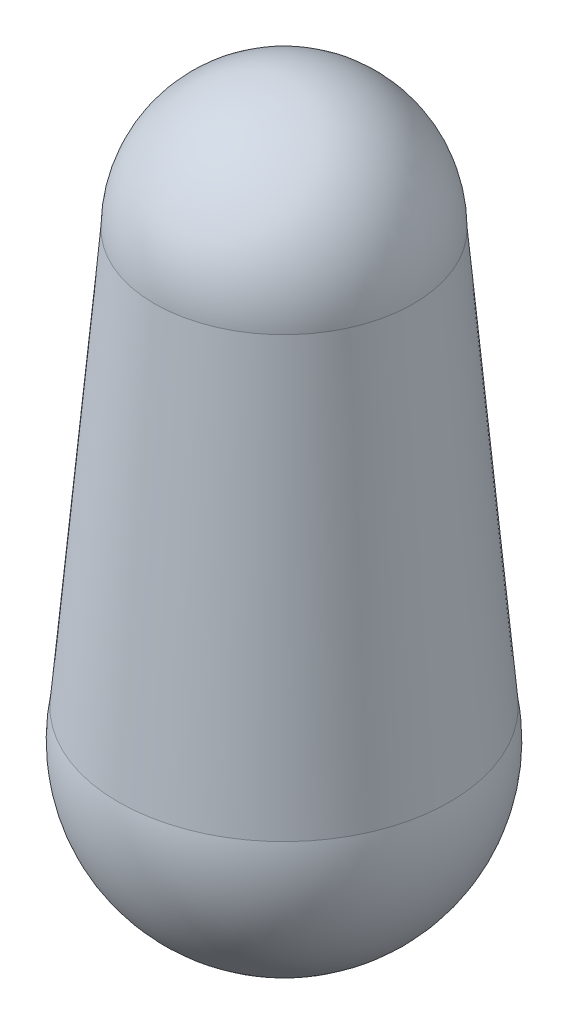
ISO-10303-21;
HEADER;
FILE_DESCRIPTION(('STEP AP214'),'2;1');
FILE_NAME('part.step','',(''),(''),'','','');
FILE_SCHEMA(('AUTOMOTIVE_DESIGN { 1 0 10303 214 1 1 1 1 }'));
ENDSEC;
DATA;
#1=APPLICATION_CONTEXT('core data for automotive mechanical design processes');
#2=APPLICATION_PROTOCOL_DEFINITION('international standard','automotive_design',2000,#1);
#3=PRODUCT_CONTEXT('',#1,'mechanical');
#4=PRODUCT('Part','Part','',(#3));
#5=PRODUCT_RELATED_PRODUCT_CATEGORY('part','',(#4));
#6=PRODUCT_DEFINITION_FORMATION('','',#4);
#7=PRODUCT_DEFINITION_CONTEXT('part definition',#1,'design');
#8=PRODUCT_DEFINITION('design','',#6,#7);
#9=PRODUCT_DEFINITION_SHAPE('','',#8);
#10=(LENGTH_UNIT() NAMED_UNIT(*) SI_UNIT(.MILLI.,.METRE.));
#11=(NAMED_UNIT(*) PLANE_ANGLE_UNIT() SI_UNIT($,.RADIAN.));
#12=(NAMED_UNIT(*) SI_UNIT($,.STERADIAN.) SOLID_ANGLE_UNIT());
#13=UNCERTAINTY_MEASURE_WITH_UNIT(LENGTH_MEASURE(1.E-05),#10,'distance_accuracy_value','');
#14=(GEOMETRIC_REPRESENTATION_CONTEXT(3) GLOBAL_UNCERTAINTY_ASSIGNED_CONTEXT((#13)) GLOBAL_UNIT_ASSIGNED_CONTEXT((#10,
#11,#12)) REPRESENTATION_CONTEXT('',''));
#15=CARTESIAN_POINT('',(0.,0.,0.));
#16=DIRECTION('',(0.,0.,1.));
#17=DIRECTION('',(1.,0.,0.));
#18=AXIS2_PLACEMENT_3D('',#15,#16,#17);
#19=CARTESIAN_POINT('',(0.,0.,0.));
#20=DIRECTION('',(0.,0.,-1.));
#21=DIRECTION('',(1.,0.,0.));
#22=AXIS2_PLACEMENT_3D('',#19,#20,#21);
#23=SPHERICAL_SURFACE('',#22,3.8);
#24=CARTESIAN_POINT('',(0.,0.,0.));
#25=DIRECTION('',(0.,-1.,0.));
#26=DIRECTION('',(0.,0.,-1.));
#27=AXIS2_PLACEMENT_3D('',#24,#25,#26);
#28=SPHERICAL_SURFACE('',#27,3.8);
#29=CARTESIAN_POINT('',(0.,0.659863075134187,0.));
#30=DIRECTION('',(0.,-1.,0.));
#31=DIRECTION('',(0.,0.,-1.));
#32=AXIS2_PLACEMENT_3D('',#29,#30,#31);
#33=CIRCLE('',#32,3.7422694614464);
#34=CARTESIAN_POINT('',(0.,0.659863075134187,-3.7422694614464));
#35=VERTEX_POINT('',#34);
#36=EDGE_CURVE('E10',#35,#35,#33,.F.);
#37=ORIENTED_EDGE('',*,*,#36,.F.);
#38=EDGE_LOOP('',(#37));
#39=FACE_BOUND('',#38,.T.);
#40=ADVANCED_FACE('F32',(#39),#28,.T.);
#41=CARTESIAN_POINT('',(0.,0.,0.));
#42=DIRECTION('',(0.,-1.,0.));
#43=DIRECTION('',(0.,0.,1.));
#44=AXIS2_PLACEMENT_3D('',#41,#42,#43);
#45=CONICAL_SURFACE('',#44,3.8,0.0872664625997165);
#46=CARTESIAN_POINT('',(0.,10.,0.));
#47=DIRECTION('',(0.,1.,0.));
#48=DIRECTION('',(0.,0.,1.));
#49=AXIS2_PLACEMENT_3D('',#46,#47,#48);
#50=CIRCLE('',#49,2.92511336474076);
#51=CARTESIAN_POINT('',(0.,10.,2.92511336474076));
#52=VERTEX_POINT('',#51);
#53=EDGE_CURVE('E38',#52,#52,#50,.T.);
#54=ORIENTED_EDGE('',*,*,#53,.F.);
#55=EDGE_LOOP('',(#54));
#56=FACE_BOUND('',#55,.T.);
#57=ORIENTED_EDGE('',*,*,#36,.T.);
#58=EDGE_LOOP('',(#57));
#59=FACE_BOUND('',#58,.T.);
#60=ADVANCED_FACE('F46',(#56,#59),#45,.T.);
#61=CARTESIAN_POINT('',(0.,10.,0.));
#62=DIRECTION('',(0.,0.,-1.));
#63=DIRECTION('',(1.,0.,0.));
#64=AXIS2_PLACEMENT_3D('',#61,#62,#63);
#65=SPHERICAL_SURFACE('',#64,2.92511336474076);
#66=CARTESIAN_POINT('',(0.,10.,0.));
#67=DIRECTION('',(0.,1.,0.));
#68=DIRECTION('',(0.,0.,1.));
#69=AXIS2_PLACEMENT_3D('',#66,#67,#68);
#70=SPHERICAL_SURFACE('',#69,2.92511336474076);
#71=ORIENTED_EDGE('',*,*,#53,.T.);
#72=EDGE_LOOP('',(#71));
#73=FACE_BOUND('',#72,.T.);
#74=ADVANCED_FACE('F44',(#73),#70,.T.);
#75=CLOSED_SHELL('',(#40,#60,#74));
#76=MANIFOLD_SOLID_BREP('B2',#75);
#77=ADVANCED_BREP_SHAPE_REPRESENTATION('',(#18,#76),#14);
#78=SHAPE_DEFINITION_REPRESENTATION(#9,#77);
ENDSEC;
END-ISO-10303-21;
